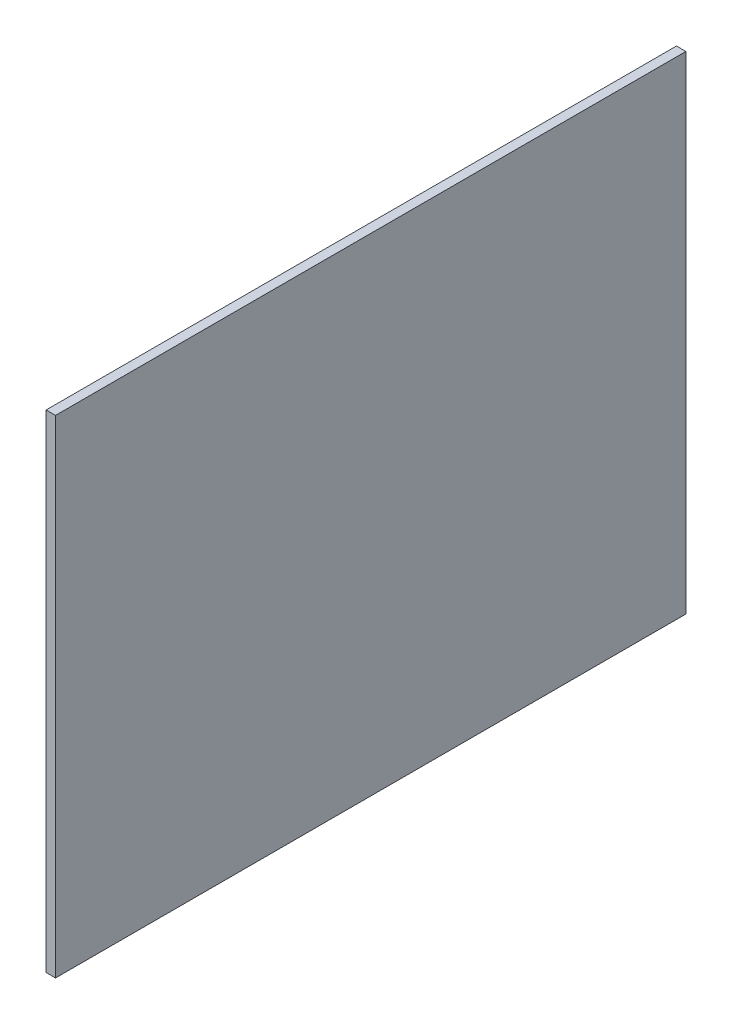
ISO-10303-21;
HEADER;
FILE_DESCRIPTION(('STEP AP214'),'2;1');
FILE_NAME('part.step','',(''),(''),'','','');
FILE_SCHEMA(('AUTOMOTIVE_DESIGN { 1 0 10303 214 1 1 1 1 }'));
ENDSEC;
DATA;
#1=APPLICATION_CONTEXT('core data for automotive mechanical design processes');
#2=APPLICATION_PROTOCOL_DEFINITION('international standard','automotive_design',2000,#1);
#3=PRODUCT_CONTEXT('',#1,'mechanical');
#4=PRODUCT('Part','Part','',(#3));
#5=PRODUCT_RELATED_PRODUCT_CATEGORY('part','',(#4));
#6=PRODUCT_DEFINITION_FORMATION('','',#4);
#7=PRODUCT_DEFINITION_CONTEXT('part definition',#1,'design');
#8=PRODUCT_DEFINITION('design','',#6,#7);
#9=PRODUCT_DEFINITION_SHAPE('','',#8);
#10=(LENGTH_UNIT() NAMED_UNIT(*) SI_UNIT(.MILLI.,.METRE.));
#11=(NAMED_UNIT(*) PLANE_ANGLE_UNIT() SI_UNIT($,.RADIAN.));
#12=(NAMED_UNIT(*) SI_UNIT($,.STERADIAN.) SOLID_ANGLE_UNIT());
#13=UNCERTAINTY_MEASURE_WITH_UNIT(LENGTH_MEASURE(1.E-05),#10,'distance_accuracy_value','');
#14=(GEOMETRIC_REPRESENTATION_CONTEXT(3) GLOBAL_UNCERTAINTY_ASSIGNED_CONTEXT((#13)) GLOBAL_UNIT_ASSIGNED_CONTEXT((#10,
#11,#12)) REPRESENTATION_CONTEXT('',''));
#15=CARTESIAN_POINT('',(0.,0.,0.));
#16=DIRECTION('',(0.,0.,1.));
#17=DIRECTION('',(1.,0.,0.));
#18=AXIS2_PLACEMENT_3D('',#15,#16,#17);
#19=CARTESIAN_POINT('',(816.5,-580.,1285.));
#20=DIRECTION('',(-1.,0.,0.));
#21=DIRECTION('',(0.,-1.,0.));
#22=AXIS2_PLACEMENT_3D('',#19,#20,#21);
#23=PLANE('',#22);
#24=DIRECTION('',(0.,1.,0.));
#25=VECTOR('',#24,1.);
#26=CARTESIAN_POINT('',(816.5,-968.,1787.));
#27=LINE('',#26,#25);
#28=CARTESIAN_POINT('',(816.5,-968.,1787.));
#29=VERTEX_POINT('',#28);
#30=CARTESIAN_POINT('',(816.5,-192.,1787.));
#31=VERTEX_POINT('',#30);
#32=EDGE_CURVE('E102',#29,#31,#27,.T.);
#33=ORIENTED_EDGE('',*,*,#32,.F.);
#34=DIRECTION('',(0.,0.,1.));
#35=VECTOR('',#34,1.);
#36=CARTESIAN_POINT('',(816.5,-968.,783.));
#37=LINE('',#36,#35);
#38=CARTESIAN_POINT('',(816.5,-968.,783.));
#39=VERTEX_POINT('',#38);
#40=EDGE_CURVE('E36',#39,#29,#37,.T.);
#41=ORIENTED_EDGE('',*,*,#40,.F.);
#42=DIRECTION('',(0.,-1.,0.));
#43=VECTOR('',#42,1.);
#44=CARTESIAN_POINT('',(816.5,-192.,783.));
#45=LINE('',#44,#43);
#46=CARTESIAN_POINT('',(816.5,-192.,783.));
#47=VERTEX_POINT('',#46);
#48=EDGE_CURVE('E110',#47,#39,#45,.T.);
#49=ORIENTED_EDGE('',*,*,#48,.F.);
#50=DIRECTION('',(0.,0.,-1.));
#51=VECTOR('',#50,1.);
#52=CARTESIAN_POINT('',(816.5,-192.,1787.));
#53=LINE('',#52,#51);
#54=EDGE_CURVE('E27',#31,#47,#53,.T.);
#55=ORIENTED_EDGE('',*,*,#54,.F.);
#56=EDGE_LOOP('',(#33,#41,#49,#55));
#57=FACE_BOUND('',#56,.T.);
#58=ADVANCED_FACE('F17',(#57),#23,.F.);
#59=CARTESIAN_POINT('',(816.5,-192.,1787.));
#60=DIRECTION('',(0.,1.,0.));
#61=DIRECTION('',(-1.,0.,0.));
#62=AXIS2_PLACEMENT_3D('',#59,#60,#61);
#63=PLANE('',#62);
#64=DIRECTION('',(-1.,0.,0.));
#65=VECTOR('',#64,1.);
#66=CARTESIAN_POINT('',(816.5,-192.,783.));
#67=LINE('',#66,#65);
#68=CARTESIAN_POINT('',(801.5,-192.,783.));
#69=VERTEX_POINT('',#68);
#70=EDGE_CURVE('E11',#47,#69,#67,.T.);
#71=ORIENTED_EDGE('',*,*,#70,.T.);
#72=DIRECTION('',(0.,0.,-1.));
#73=VECTOR('',#72,1.);
#74=CARTESIAN_POINT('',(801.5,-192.,1787.));
#75=LINE('',#74,#73);
#76=CARTESIAN_POINT('',(801.5,-192.,1787.));
#77=VERTEX_POINT('',#76);
#78=EDGE_CURVE('E58',#77,#69,#75,.T.);
#79=ORIENTED_EDGE('',*,*,#78,.F.);
#80=DIRECTION('',(-1.,0.,0.));
#81=VECTOR('',#80,1.);
#82=CARTESIAN_POINT('',(816.5,-192.,1787.));
#83=LINE('',#82,#81);
#84=EDGE_CURVE('E105',#31,#77,#83,.T.);
#85=ORIENTED_EDGE('',*,*,#84,.F.);
#86=ORIENTED_EDGE('',*,*,#54,.T.);
#87=EDGE_LOOP('',(#71,#79,#85,#86));
#88=FACE_BOUND('',#87,.T.);
#89=ADVANCED_FACE('F113',(#88),#63,.T.);
#90=CARTESIAN_POINT('',(816.5,-968.,1787.));
#91=DIRECTION('',(0.,0.,1.));
#92=DIRECTION('',(0.,-1.,0.));
#93=AXIS2_PLACEMENT_3D('',#90,#91,#92);
#94=PLANE('',#93);
#95=ORIENTED_EDGE('',*,*,#84,.T.);
#96=DIRECTION('',(0.,1.,0.));
#97=VECTOR('',#96,1.);
#98=CARTESIAN_POINT('',(801.5,-968.,1787.));
#99=LINE('',#98,#97);
#100=CARTESIAN_POINT('',(801.5,-968.,1787.));
#101=VERTEX_POINT('',#100);
#102=EDGE_CURVE('E67',#101,#77,#99,.T.);
#103=ORIENTED_EDGE('',*,*,#102,.F.);
#104=DIRECTION('',(-1.,0.,0.));
#105=VECTOR('',#104,1.);
#106=CARTESIAN_POINT('',(816.5,-968.,1787.));
#107=LINE('',#106,#105);
#108=EDGE_CURVE('E106',#29,#101,#107,.T.);
#109=ORIENTED_EDGE('',*,*,#108,.F.);
#110=ORIENTED_EDGE('',*,*,#32,.T.);
#111=EDGE_LOOP('',(#95,#103,#109,#110));
#112=FACE_BOUND('',#111,.T.);
#113=ADVANCED_FACE('F104',(#112),#94,.T.);
#114=CARTESIAN_POINT('',(816.5,-968.,783.));
#115=DIRECTION('',(0.,-1.,0.));
#116=DIRECTION('',(0.,0.,1.));
#117=AXIS2_PLACEMENT_3D('',#114,#115,#116);
#118=PLANE('',#117);
#119=ORIENTED_EDGE('',*,*,#108,.T.);
#120=DIRECTION('',(0.,0.,1.));
#121=VECTOR('',#120,1.);
#122=CARTESIAN_POINT('',(801.5,-968.,783.));
#123=LINE('',#122,#121);
#124=CARTESIAN_POINT('',(801.5,-968.,783.));
#125=VERTEX_POINT('',#124);
#126=EDGE_CURVE('E133',#125,#101,#123,.T.);
#127=ORIENTED_EDGE('',*,*,#126,.F.);
#128=DIRECTION('',(-1.,0.,0.));
#129=VECTOR('',#128,1.);
#130=CARTESIAN_POINT('',(816.5,-968.,783.));
#131=LINE('',#130,#129);
#132=EDGE_CURVE('E120',#39,#125,#131,.T.);
#133=ORIENTED_EDGE('',*,*,#132,.F.);
#134=ORIENTED_EDGE('',*,*,#40,.T.);
#135=EDGE_LOOP('',(#119,#127,#133,#134));
#136=FACE_BOUND('',#135,.T.);
#137=ADVANCED_FACE('F196',(#136),#118,.T.);
#138=CARTESIAN_POINT('',(816.5,-192.,783.));
#139=DIRECTION('',(0.,0.,-1.));
#140=DIRECTION('',(1.,0.,0.));
#141=AXIS2_PLACEMENT_3D('',#138,#139,#140);
#142=PLANE('',#141);
#143=ORIENTED_EDGE('',*,*,#132,.T.);
#144=DIRECTION('',(0.,-1.,0.));
#145=VECTOR('',#144,1.);
#146=CARTESIAN_POINT('',(801.5,-192.,783.));
#147=LINE('',#146,#145);
#148=EDGE_CURVE('E138',#69,#125,#147,.T.);
#149=ORIENTED_EDGE('',*,*,#148,.F.);
#150=ORIENTED_EDGE('',*,*,#70,.F.);
#151=ORIENTED_EDGE('',*,*,#48,.T.);
#152=EDGE_LOOP('',(#143,#149,#150,#151));
#153=FACE_BOUND('',#152,.T.);
#154=ADVANCED_FACE('F198',(#153),#142,.T.);
#155=CARTESIAN_POINT('',(801.5,-580.,1285.));
#156=DIRECTION('',(-1.,0.,0.));
#157=DIRECTION('',(0.,-1.,0.));
#158=AXIS2_PLACEMENT_3D('',#155,#156,#157);
#159=PLANE('',#158);
#160=ORIENTED_EDGE('',*,*,#148,.T.);
#161=ORIENTED_EDGE('',*,*,#126,.T.);
#162=ORIENTED_EDGE('',*,*,#102,.T.);
#163=ORIENTED_EDGE('',*,*,#78,.T.);
#164=EDGE_LOOP('',(#160,#161,#162,#163));
#165=FACE_BOUND('',#164,.T.);
#166=DIRECTION('',(0.,1.,0.));
#167=VECTOR('',#166,1.);
#168=CARTESIAN_POINT('',(801.5,-920.,1739.));
#169=LINE('',#168,#167);
#170=CARTESIAN_POINT('',(801.5,-920.,1739.));
#171=VERTEX_POINT('',#170);
#172=CARTESIAN_POINT('',(801.5,-240.,1739.));
#173=VERTEX_POINT('',#172);
#174=EDGE_CURVE('E136',#171,#173,#169,.T.);
#175=ORIENTED_EDGE('',*,*,#174,.F.);
#176=DIRECTION('',(0.,0.,1.));
#177=VECTOR('',#176,1.);
#178=CARTESIAN_POINT('',(801.5,-920.,831.));
#179=LINE('',#178,#177);
#180=CARTESIAN_POINT('',(801.5,-920.,831.));
#181=VERTEX_POINT('',#180);
#182=EDGE_CURVE('E124',#181,#171,#179,.T.);
#183=ORIENTED_EDGE('',*,*,#182,.F.);
#184=DIRECTION('',(0.,-1.,0.));
#185=VECTOR('',#184,1.);
#186=CARTESIAN_POINT('',(801.5,-347.,831.));
#187=LINE('',#186,#185);
#188=CARTESIAN_POINT('',(801.5,-347.,831.));
#189=VERTEX_POINT('',#188);
#190=EDGE_CURVE('E125',#189,#181,#187,.T.);
#191=ORIENTED_EDGE('',*,*,#190,.F.);
#192=CARTESIAN_POINT('',(801.5,-347.,938.));
#193=DIRECTION('',(-1.,0.,0.));
#194=DIRECTION('',(0.,1.,0.));
#195=AXIS2_PLACEMENT_3D('',#192,#193,#194);
#196=CIRCLE('',#195,107.);
#197=CARTESIAN_POINT('',(801.5,-240.,938.));
#198=VERTEX_POINT('',#197);
#199=EDGE_CURVE('E148',#198,#189,#196,.T.);
#200=ORIENTED_EDGE('',*,*,#199,.F.);
#201=DIRECTION('',(0.,0.,-1.));
#202=VECTOR('',#201,1.);
#203=CARTESIAN_POINT('',(801.5,-240.,1739.));
#204=LINE('',#203,#202);
#205=EDGE_CURVE('E147',#173,#198,#204,.T.);
#206=ORIENTED_EDGE('',*,*,#205,.F.);
#207=EDGE_LOOP('',(#175,#183,#191,#200,#206));
#208=FACE_BOUND('',#207,.T.);
#209=ADVANCED_FACE('F165',(#165,#208),#159,.T.);
#210=CARTESIAN_POINT('',(801.5,-240.,1739.));
#211=DIRECTION('',(0.,1.,0.));
#212=DIRECTION('',(-1.,0.,0.));
#213=AXIS2_PLACEMENT_3D('',#210,#211,#212);
#214=PLANE('',#213);
#215=DIRECTION('',(1.,0.,0.));
#216=VECTOR('',#215,1.);
#217=CARTESIAN_POINT('',(801.5,-240.,938.));
#218=LINE('',#217,#216);
#219=CARTESIAN_POINT('',(804.5,-240.,938.));
#220=VERTEX_POINT('',#219);
#221=EDGE_CURVE('E143',#198,#220,#218,.T.);
#222=ORIENTED_EDGE('',*,*,#221,.T.);
#223=DIRECTION('',(0.,0.,-1.));
#224=VECTOR('',#223,1.);
#225=CARTESIAN_POINT('',(804.5,-240.,1739.));
#226=LINE('',#225,#224);
#227=CARTESIAN_POINT('',(804.5,-240.,1739.));
#228=VERTEX_POINT('',#227);
#229=EDGE_CURVE('E81',#228,#220,#226,.T.);
#230=ORIENTED_EDGE('',*,*,#229,.F.);
#231=DIRECTION('',(1.,0.,0.));
#232=VECTOR('',#231,1.);
#233=CARTESIAN_POINT('',(801.5,-240.,1739.));
#234=LINE('',#233,#232);
#235=EDGE_CURVE('E21',#173,#228,#234,.T.);
#236=ORIENTED_EDGE('',*,*,#235,.F.);
#237=ORIENTED_EDGE('',*,*,#205,.T.);
#238=EDGE_LOOP('',(#222,#230,#236,#237));
#239=FACE_BOUND('',#238,.T.);
#240=ADVANCED_FACE('F177',(#239),#214,.F.);
#241=CARTESIAN_POINT('',(801.5,-920.,1739.));
#242=DIRECTION('',(0.,0.,1.));
#243=DIRECTION('',(0.,-1.,0.));
#244=AXIS2_PLACEMENT_3D('',#241,#242,#243);
#245=PLANE('',#244);
#246=ORIENTED_EDGE('',*,*,#235,.T.);
#247=DIRECTION('',(0.,1.,0.));
#248=VECTOR('',#247,1.);
#249=CARTESIAN_POINT('',(804.5,-920.,1739.));
#250=LINE('',#249,#248);
#251=CARTESIAN_POINT('',(804.5,-920.,1739.));
#252=VERTEX_POINT('',#251);
#253=EDGE_CURVE('E88',#252,#228,#250,.T.);
#254=ORIENTED_EDGE('',*,*,#253,.F.);
#255=DIRECTION('',(1.,0.,0.));
#256=VECTOR('',#255,1.);
#257=CARTESIAN_POINT('',(801.5,-920.,1739.));
#258=LINE('',#257,#256);
#259=EDGE_CURVE('E134',#171,#252,#258,.T.);
#260=ORIENTED_EDGE('',*,*,#259,.F.);
#261=ORIENTED_EDGE('',*,*,#174,.T.);
#262=EDGE_LOOP('',(#246,#254,#260,#261));
#263=FACE_BOUND('',#262,.T.);
#264=ADVANCED_FACE('F179',(#263),#245,.F.);
#265=CARTESIAN_POINT('',(801.5,-920.,831.));
#266=DIRECTION('',(0.,-1.,0.));
#267=DIRECTION('',(0.,0.,1.));
#268=AXIS2_PLACEMENT_3D('',#265,#266,#267);
#269=PLANE('',#268);
#270=ORIENTED_EDGE('',*,*,#259,.T.);
#271=DIRECTION('',(0.,0.,1.));
#272=VECTOR('',#271,1.);
#273=CARTESIAN_POINT('',(804.5,-920.,831.));
#274=LINE('',#273,#272);
#275=CARTESIAN_POINT('',(804.5,-920.,831.));
#276=VERTEX_POINT('',#275);
#277=EDGE_CURVE('E128',#276,#252,#274,.T.);
#278=ORIENTED_EDGE('',*,*,#277,.F.);
#279=DIRECTION('',(1.,0.,0.));
#280=VECTOR('',#279,1.);
#281=CARTESIAN_POINT('',(801.5,-920.,831.));
#282=LINE('',#281,#280);
#283=EDGE_CURVE('E121',#181,#276,#282,.T.);
#284=ORIENTED_EDGE('',*,*,#283,.F.);
#285=ORIENTED_EDGE('',*,*,#182,.T.);
#286=EDGE_LOOP('',(#270,#278,#284,#285));
#287=FACE_BOUND('',#286,.T.);
#288=ADVANCED_FACE('F168',(#287),#269,.F.);
#289=CARTESIAN_POINT('',(801.5,-347.,831.));
#290=DIRECTION('',(0.,0.,-1.));
#291=DIRECTION('',(1.,0.,0.));
#292=AXIS2_PLACEMENT_3D('',#289,#290,#291);
#293=PLANE('',#292);
#294=ORIENTED_EDGE('',*,*,#283,.T.);
#295=DIRECTION('',(0.,-1.,0.));
#296=VECTOR('',#295,1.);
#297=CARTESIAN_POINT('',(804.5,-347.,831.));
#298=LINE('',#297,#296);
#299=CARTESIAN_POINT('',(804.5,-347.,831.));
#300=VERTEX_POINT('',#299);
#301=EDGE_CURVE('E131',#300,#276,#298,.T.);
#302=ORIENTED_EDGE('',*,*,#301,.F.);
#303=DIRECTION('',(1.,0.,0.));
#304=VECTOR('',#303,1.);
#305=CARTESIAN_POINT('',(801.5,-347.,831.));
#306=LINE('',#305,#304);
#307=EDGE_CURVE('E150',#189,#300,#306,.T.);
#308=ORIENTED_EDGE('',*,*,#307,.F.);
#309=ORIENTED_EDGE('',*,*,#190,.T.);
#310=EDGE_LOOP('',(#294,#302,#308,#309));
#311=FACE_BOUND('',#310,.T.);
#312=ADVANCED_FACE('F19',(#311),#293,.F.);
#313=CARTESIAN_POINT('',(801.5,-347.,938.));
#314=DIRECTION('',(-1.,0.,0.));
#315=DIRECTION('',(0.,-1.,0.));
#316=AXIS2_PLACEMENT_3D('',#313,#314,#315);
#317=CYLINDRICAL_SURFACE('',#316,107.);
#318=ORIENTED_EDGE('',*,*,#307,.T.);
#319=CARTESIAN_POINT('',(804.5,-347.,938.));
#320=DIRECTION('',(-1.,0.,0.));
#321=DIRECTION('',(0.,1.,0.));
#322=AXIS2_PLACEMENT_3D('',#319,#320,#321);
#323=CIRCLE('',#322,107.);
#324=EDGE_CURVE('E117',#220,#300,#323,.T.);
#325=ORIENTED_EDGE('',*,*,#324,.F.);
#326=ORIENTED_EDGE('',*,*,#221,.F.);
#327=ORIENTED_EDGE('',*,*,#199,.T.);
#328=EDGE_LOOP('',(#318,#325,#326,#327));
#329=FACE_BOUND('',#328,.T.);
#330=ADVANCED_FACE('F174',(#329),#317,.F.);
#331=CARTESIAN_POINT('',(804.5,-580.,1285.));
#332=DIRECTION('',(-1.,0.,0.));
#333=DIRECTION('',(0.,-1.,0.));
#334=AXIS2_PLACEMENT_3D('',#331,#332,#333);
#335=PLANE('',#334);
#336=ORIENTED_EDGE('',*,*,#324,.T.);
#337=ORIENTED_EDGE('',*,*,#301,.T.);
#338=ORIENTED_EDGE('',*,*,#277,.T.);
#339=ORIENTED_EDGE('',*,*,#253,.T.);
#340=ORIENTED_EDGE('',*,*,#229,.T.);
#341=EDGE_LOOP('',(#336,#337,#338,#339,#340));
#342=FACE_BOUND('',#341,.T.);
#343=ADVANCED_FACE('F171',(#342),#335,.T.);
#344=CLOSED_SHELL('',(#58,#89,#113,#137,#154,#209,#240,#264,#288,#312,#330,#343));
#345=MANIFOLD_SOLID_BREP('B1',#344);
#346=ADVANCED_BREP_SHAPE_REPRESENTATION('',(#18,#345),#14);
#347=SHAPE_DEFINITION_REPRESENTATION(#9,#346);
ENDSEC;
END-ISO-10303-21;
